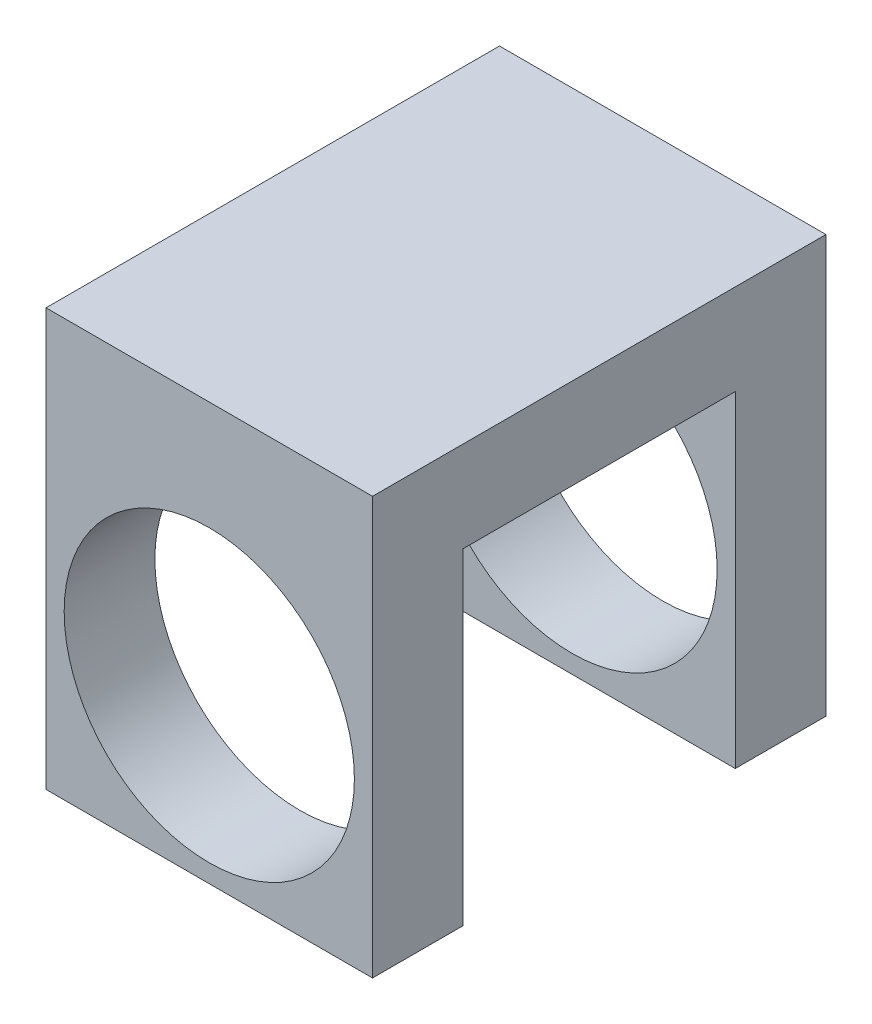
ISO-10303-21;
HEADER;
FILE_DESCRIPTION(('STEP AP214'),'2;1');
FILE_NAME('part.step','',(''),(''),'','','');
FILE_SCHEMA(('AUTOMOTIVE_DESIGN { 1 0 10303 214 1 1 1 1 }'));
ENDSEC;
DATA;
#1=APPLICATION_CONTEXT('core data for automotive mechanical design processes');
#2=APPLICATION_PROTOCOL_DEFINITION('international standard','automotive_design',2000,#1);
#3=PRODUCT_CONTEXT('',#1,'mechanical');
#4=PRODUCT('Part','Part','',(#3));
#5=PRODUCT_RELATED_PRODUCT_CATEGORY('part','',(#4));
#6=PRODUCT_DEFINITION_FORMATION('','',#4);
#7=PRODUCT_DEFINITION_CONTEXT('part definition',#1,'design');
#8=PRODUCT_DEFINITION('design','',#6,#7);
#9=PRODUCT_DEFINITION_SHAPE('','',#8);
#10=(LENGTH_UNIT() NAMED_UNIT(*) SI_UNIT(.MILLI.,.METRE.));
#11=(NAMED_UNIT(*) PLANE_ANGLE_UNIT() SI_UNIT($,.RADIAN.));
#12=(NAMED_UNIT(*) SI_UNIT($,.STERADIAN.) SOLID_ANGLE_UNIT());
#13=UNCERTAINTY_MEASURE_WITH_UNIT(LENGTH_MEASURE(1.E-05),#10,'distance_accuracy_value','');
#14=(GEOMETRIC_REPRESENTATION_CONTEXT(3) GLOBAL_UNCERTAINTY_ASSIGNED_CONTEXT((#13)) GLOBAL_UNIT_ASSIGNED_CONTEXT((#10,
#11,#12)) REPRESENTATION_CONTEXT('',''));
#15=CARTESIAN_POINT('',(0.,0.,0.));
#16=DIRECTION('',(0.,0.,1.));
#17=DIRECTION('',(1.,0.,0.));
#18=AXIS2_PLACEMENT_3D('',#15,#16,#17);
#19=CARTESIAN_POINT('',(0.,9.,0.));
#20=DIRECTION('',(0.,-1.,0.));
#21=DIRECTION('',(0.,0.,-1.));
#22=AXIS2_PLACEMENT_3D('',#19,#20,#21);
#23=PLANE('',#22);
#24=DIRECTION('',(0.,0.,1.));
#25=VECTOR('',#24,1.);
#26=CARTESIAN_POINT('',(-9.,9.,5.));
#27=LINE('',#26,#25);
#28=CARTESIAN_POINT('',(-9.,9.,-15.));
#29=VERTEX_POINT('',#28);
#30=CARTESIAN_POINT('',(-9.,9.,0.));
#31=VERTEX_POINT('',#30);
#32=EDGE_CURVE('E117',#29,#31,#27,.T.);
#33=ORIENTED_EDGE('',*,*,#32,.F.);
#34=DIRECTION('',(-1.,0.,0.));
#35=VECTOR('',#34,1.);
#36=CARTESIAN_POINT('',(-9.,9.,-15.));
#37=LINE('',#36,#35);
#38=CARTESIAN_POINT('',(9.,9.,-15.));
#39=VERTEX_POINT('',#38);
#40=EDGE_CURVE('E122',#39,#29,#37,.T.);
#41=ORIENTED_EDGE('',*,*,#40,.F.);
#42=DIRECTION('',(0.,0.,-1.));
#43=VECTOR('',#42,1.);
#44=CARTESIAN_POINT('',(9.,9.,5.));
#45=LINE('',#44,#43);
#46=CARTESIAN_POINT('',(9.,9.,0.));
#47=VERTEX_POINT('',#46);
#48=EDGE_CURVE('E121',#47,#39,#45,.T.);
#49=ORIENTED_EDGE('',*,*,#48,.F.);
#50=DIRECTION('',(-1.,0.,0.));
#51=VECTOR('',#50,1.);
#52=CARTESIAN_POINT('',(-9.,9.,0.));
#53=LINE('',#52,#51);
#54=EDGE_CURVE('E101',#47,#31,#53,.T.);
#55=ORIENTED_EDGE('',*,*,#54,.T.);
#56=EDGE_LOOP('',(#33,#41,#49,#55));
#57=FACE_BOUND('',#56,.T.);
#58=ADVANCED_FACE('F43',(#57),#23,.T.);
#59=CARTESIAN_POINT('',(9.,-9.,5.));
#60=DIRECTION('',(-1.,0.,0.));
#61=DIRECTION('',(0.,0.,1.));
#62=AXIS2_PLACEMENT_3D('',#59,#60,#61);
#63=PLANE('',#62);
#64=DIRECTION('',(0.,1.,0.));
#65=VECTOR('',#64,1.);
#66=CARTESIAN_POINT('',(9.,-9.,0.));
#67=LINE('',#66,#65);
#68=CARTESIAN_POINT('',(9.,-9.,0.));
#69=VERTEX_POINT('',#68);
#70=EDGE_CURVE('E96',#69,#47,#67,.T.);
#71=ORIENTED_EDGE('',*,*,#70,.T.);
#72=ORIENTED_EDGE('',*,*,#48,.T.);
#73=DIRECTION('',(0.,1.,0.));
#74=VECTOR('',#73,1.);
#75=CARTESIAN_POINT('',(9.,-9.,-15.));
#76=LINE('',#75,#74);
#77=CARTESIAN_POINT('',(9.,-9.,-15.));
#78=VERTEX_POINT('',#77);
#79=EDGE_CURVE('E58',#78,#39,#76,.T.);
#80=ORIENTED_EDGE('',*,*,#79,.F.);
#81=DIRECTION('',(0.,0.,1.));
#82=VECTOR('',#81,1.);
#83=CARTESIAN_POINT('',(9.,-9.,-20.));
#84=LINE('',#83,#82);
#85=CARTESIAN_POINT('',(9.,-9.,-20.));
#86=VERTEX_POINT('',#85);
#87=EDGE_CURVE('E181',#86,#78,#84,.T.);
#88=ORIENTED_EDGE('',*,*,#87,.F.);
#89=DIRECTION('',(0.,-1.,0.));
#90=VECTOR('',#89,1.);
#91=CARTESIAN_POINT('',(9.,14.,-20.));
#92=LINE('',#91,#90);
#93=CARTESIAN_POINT('',(9.,14.,-20.));
#94=VERTEX_POINT('',#93);
#95=EDGE_CURVE('E134',#94,#86,#92,.T.);
#96=ORIENTED_EDGE('',*,*,#95,.F.);
#97=DIRECTION('',(0.,0.,-1.));
#98=VECTOR('',#97,1.);
#99=CARTESIAN_POINT('',(9.,14.,5.));
#100=LINE('',#99,#98);
#101=CARTESIAN_POINT('',(9.,14.,5.));
#102=VERTEX_POINT('',#101);
#103=EDGE_CURVE('E163',#102,#94,#100,.T.);
#104=ORIENTED_EDGE('',*,*,#103,.F.);
#105=DIRECTION('',(0.,1.,0.));
#106=VECTOR('',#105,1.);
#107=CARTESIAN_POINT('',(9.,-9.,5.));
#108=LINE('',#107,#106);
#109=CARTESIAN_POINT('',(9.,-9.,5.));
#110=VERTEX_POINT('',#109);
#111=EDGE_CURVE('E90',#110,#102,#108,.T.);
#112=ORIENTED_EDGE('',*,*,#111,.F.);
#113=DIRECTION('',(0.,0.,-1.));
#114=VECTOR('',#113,1.);
#115=CARTESIAN_POINT('',(9.,-9.,5.));
#116=LINE('',#115,#114);
#117=EDGE_CURVE('E51',#110,#69,#116,.T.);
#118=ORIENTED_EDGE('',*,*,#117,.T.);
#119=EDGE_LOOP('',(#71,#72,#80,#88,#96,#104,#112,#118));
#120=FACE_BOUND('',#119,.T.);
#121=ADVANCED_FACE('F45',(#120),#63,.F.);
#122=CARTESIAN_POINT('',(-9.,-9.,5.));
#123=DIRECTION('',(1.,0.,0.));
#124=DIRECTION('',(0.,0.,-1.));
#125=AXIS2_PLACEMENT_3D('',#122,#123,#124);
#126=PLANE('',#125);
#127=DIRECTION('',(0.,-1.,0.));
#128=VECTOR('',#127,1.);
#129=CARTESIAN_POINT('',(-9.,-9.,0.));
#130=LINE('',#129,#128);
#131=CARTESIAN_POINT('',(-9.,-9.,0.));
#132=VERTEX_POINT('',#131);
#133=EDGE_CURVE('E91',#31,#132,#130,.T.);
#134=ORIENTED_EDGE('',*,*,#133,.T.);
#135=DIRECTION('',(0.,0.,-1.));
#136=VECTOR('',#135,1.);
#137=CARTESIAN_POINT('',(-9.,-9.,5.));
#138=LINE('',#137,#136);
#139=CARTESIAN_POINT('',(-9.,-9.,5.));
#140=VERTEX_POINT('',#139);
#141=EDGE_CURVE('E11',#140,#132,#138,.T.);
#142=ORIENTED_EDGE('',*,*,#141,.F.);
#143=DIRECTION('',(0.,-1.,0.));
#144=VECTOR('',#143,1.);
#145=CARTESIAN_POINT('',(-9.,-9.,5.));
#146=LINE('',#145,#144);
#147=CARTESIAN_POINT('',(-9.,14.,5.));
#148=VERTEX_POINT('',#147);
#149=EDGE_CURVE('E140',#148,#140,#146,.T.);
#150=ORIENTED_EDGE('',*,*,#149,.F.);
#151=DIRECTION('',(0.,0.,1.));
#152=VECTOR('',#151,1.);
#153=CARTESIAN_POINT('',(-9.,14.,5.));
#154=LINE('',#153,#152);
#155=CARTESIAN_POINT('',(-9.,14.,-20.));
#156=VERTEX_POINT('',#155);
#157=EDGE_CURVE('E123',#156,#148,#154,.T.);
#158=ORIENTED_EDGE('',*,*,#157,.F.);
#159=DIRECTION('',(0.,-1.,0.));
#160=VECTOR('',#159,1.);
#161=CARTESIAN_POINT('',(-9.,14.,-20.));
#162=LINE('',#161,#160);
#163=CARTESIAN_POINT('',(-9.,-9.,-20.));
#164=VERTEX_POINT('',#163);
#165=EDGE_CURVE('E131',#156,#164,#162,.T.);
#166=ORIENTED_EDGE('',*,*,#165,.T.);
#167=DIRECTION('',(0.,0.,-1.));
#168=VECTOR('',#167,1.);
#169=CARTESIAN_POINT('',(-9.,-9.,-20.));
#170=LINE('',#169,#168);
#171=CARTESIAN_POINT('',(-9.,-9.,-15.));
#172=VERTEX_POINT('',#171);
#173=EDGE_CURVE('E173',#172,#164,#170,.T.);
#174=ORIENTED_EDGE('',*,*,#173,.F.);
#175=DIRECTION('',(0.,1.,0.));
#176=VECTOR('',#175,1.);
#177=CARTESIAN_POINT('',(-9.,-9.,-15.));
#178=LINE('',#177,#176);
#179=EDGE_CURVE('E186',#172,#29,#178,.T.);
#180=ORIENTED_EDGE('',*,*,#179,.T.);
#181=ORIENTED_EDGE('',*,*,#32,.T.);
#182=EDGE_LOOP('',(#134,#142,#150,#158,#166,#174,#180,#181));
#183=FACE_BOUND('',#182,.T.);
#184=ADVANCED_FACE('F113',(#183),#126,.F.);
#185=CARTESIAN_POINT('',(-9.,-9.,5.));
#186=DIRECTION('',(0.,1.,0.));
#187=DIRECTION('',(0.,0.,1.));
#188=AXIS2_PLACEMENT_3D('',#185,#186,#187);
#189=PLANE('',#188);
#190=DIRECTION('',(1.,0.,0.));
#191=VECTOR('',#190,1.);
#192=CARTESIAN_POINT('',(-9.,-9.,0.));
#193=LINE('',#192,#191);
#194=EDGE_CURVE('E82',#132,#69,#193,.T.);
#195=ORIENTED_EDGE('',*,*,#194,.T.);
#196=ORIENTED_EDGE('',*,*,#117,.F.);
#197=DIRECTION('',(1.,0.,0.));
#198=VECTOR('',#197,1.);
#199=CARTESIAN_POINT('',(-9.,-9.,5.));
#200=LINE('',#199,#198);
#201=EDGE_CURVE('E67',#140,#110,#200,.T.);
#202=ORIENTED_EDGE('',*,*,#201,.F.);
#203=ORIENTED_EDGE('',*,*,#141,.T.);
#204=EDGE_LOOP('',(#195,#196,#202,#203));
#205=FACE_BOUND('',#204,.T.);
#206=ADVANCED_FACE('F84',(#205),#189,.F.);
#207=CARTESIAN_POINT('',(0.,0.,5.));
#208=DIRECTION('',(0.,0.,-1.));
#209=DIRECTION('',(-1.,0.,0.));
#210=AXIS2_PLACEMENT_3D('',#207,#208,#209);
#211=PLANE('',#210);
#212=CARTESIAN_POINT('',(0.,0.,5.));
#213=DIRECTION('',(0.,0.,1.));
#214=DIRECTION('',(1.,0.,0.));
#215=AXIS2_PLACEMENT_3D('',#212,#213,#214);
#216=CIRCLE('',#215,8.);
#217=CARTESIAN_POINT('',(8.,0.,5.));
#218=VERTEX_POINT('',#217);
#219=EDGE_CURVE('E106',#218,#218,#216,.T.);
#220=ORIENTED_EDGE('',*,*,#219,.F.);
#221=EDGE_LOOP('',(#220));
#222=FACE_BOUND('',#221,.T.);
#223=ORIENTED_EDGE('',*,*,#111,.T.);
#224=DIRECTION('',(1.,0.,0.));
#225=VECTOR('',#224,1.);
#226=CARTESIAN_POINT('',(-9.,14.,5.));
#227=LINE('',#226,#225);
#228=EDGE_CURVE('E126',#148,#102,#227,.T.);
#229=ORIENTED_EDGE('',*,*,#228,.F.);
#230=ORIENTED_EDGE('',*,*,#149,.T.);
#231=ORIENTED_EDGE('',*,*,#201,.T.);
#232=EDGE_LOOP('',(#223,#229,#230,#231));
#233=FACE_BOUND('',#232,.T.);
#234=ADVANCED_FACE('F142',(#222,#233),#211,.F.);
#235=CARTESIAN_POINT('',(0.,0.,0.));
#236=DIRECTION('',(0.,0.,-1.));
#237=DIRECTION('',(-1.,0.,0.));
#238=AXIS2_PLACEMENT_3D('',#235,#236,#237);
#239=PLANE('',#238);
#240=CARTESIAN_POINT('',(0.,0.,0.));
#241=DIRECTION('',(0.,0.,1.));
#242=DIRECTION('',(1.,0.,0.));
#243=AXIS2_PLACEMENT_3D('',#240,#241,#242);
#244=CIRCLE('',#243,8.);
#245=CARTESIAN_POINT('',(8.,0.,0.));
#246=VERTEX_POINT('',#245);
#247=EDGE_CURVE('E102',#246,#246,#244,.T.);
#248=ORIENTED_EDGE('',*,*,#247,.T.);
#249=EDGE_LOOP('',(#248));
#250=FACE_BOUND('',#249,.T.);
#251=ORIENTED_EDGE('',*,*,#70,.F.);
#252=ORIENTED_EDGE('',*,*,#194,.F.);
#253=ORIENTED_EDGE('',*,*,#133,.F.);
#254=ORIENTED_EDGE('',*,*,#54,.F.);
#255=EDGE_LOOP('',(#251,#252,#253,#254));
#256=FACE_BOUND('',#255,.T.);
#257=ADVANCED_FACE('F99',(#250,#256),#239,.T.);
#258=CARTESIAN_POINT('',(0.,0.,0.));
#259=DIRECTION('',(0.,0.,1.));
#260=DIRECTION('',(1.,0.,0.));
#261=AXIS2_PLACEMENT_3D('',#258,#259,#260);
#262=CYLINDRICAL_SURFACE('',#261,8.);
#263=ORIENTED_EDGE('',*,*,#247,.F.);
#264=EDGE_LOOP('',(#263));
#265=FACE_BOUND('',#264,.T.);
#266=ORIENTED_EDGE('',*,*,#219,.T.);
#267=EDGE_LOOP('',(#266));
#268=FACE_BOUND('',#267,.T.);
#269=ADVANCED_FACE('F226',(#265,#268),#262,.F.);
#270=CARTESIAN_POINT('',(-9.,14.,-20.));
#271=DIRECTION('',(0.,0.,1.));
#272=DIRECTION('',(1.,0.,0.));
#273=AXIS2_PLACEMENT_3D('',#270,#271,#272);
#274=PLANE('',#273);
#275=CARTESIAN_POINT('',(0.,0.,-20.));
#276=DIRECTION('',(0.,0.,1.));
#277=DIRECTION('',(1.,0.,0.));
#278=AXIS2_PLACEMENT_3D('',#275,#276,#277);
#279=CIRCLE('',#278,8.);
#280=CARTESIAN_POINT('',(8.,0.,-20.));
#281=VERTEX_POINT('',#280);
#282=EDGE_CURVE('E193',#281,#281,#279,.T.);
#283=ORIENTED_EDGE('',*,*,#282,.T.);
#284=EDGE_LOOP('',(#283));
#285=FACE_BOUND('',#284,.T.);
#286=ORIENTED_EDGE('',*,*,#95,.T.);
#287=DIRECTION('',(1.,0.,0.));
#288=VECTOR('',#287,1.);
#289=CARTESIAN_POINT('',(-9.,-9.,-20.));
#290=LINE('',#289,#288);
#291=EDGE_CURVE('E170',#164,#86,#290,.T.);
#292=ORIENTED_EDGE('',*,*,#291,.F.);
#293=ORIENTED_EDGE('',*,*,#165,.F.);
#294=DIRECTION('',(-1.,0.,0.));
#295=VECTOR('',#294,1.);
#296=CARTESIAN_POINT('',(-9.,14.,-20.));
#297=LINE('',#296,#295);
#298=EDGE_CURVE('E135',#94,#156,#297,.T.);
#299=ORIENTED_EDGE('',*,*,#298,.F.);
#300=EDGE_LOOP('',(#286,#292,#293,#299));
#301=FACE_BOUND('',#300,.T.);
#302=ADVANCED_FACE('F167',(#285,#301),#274,.F.);
#303=CARTESIAN_POINT('',(0.,14.,0.));
#304=DIRECTION('',(0.,-1.,0.));
#305=DIRECTION('',(0.,0.,-1.));
#306=AXIS2_PLACEMENT_3D('',#303,#304,#305);
#307=PLANE('',#306);
#308=ORIENTED_EDGE('',*,*,#157,.T.);
#309=ORIENTED_EDGE('',*,*,#228,.T.);
#310=ORIENTED_EDGE('',*,*,#103,.T.);
#311=ORIENTED_EDGE('',*,*,#298,.T.);
#312=EDGE_LOOP('',(#308,#309,#310,#311));
#313=FACE_BOUND('',#312,.T.);
#314=ADVANCED_FACE('F162',(#313),#307,.F.);
#315=CARTESIAN_POINT('',(-9.,-9.,-15.));
#316=DIRECTION('',(0.,0.,-1.));
#317=DIRECTION('',(-1.,0.,0.));
#318=AXIS2_PLACEMENT_3D('',#315,#316,#317);
#319=PLANE('',#318);
#320=CARTESIAN_POINT('',(0.,0.,-15.));
#321=DIRECTION('',(0.,0.,1.));
#322=DIRECTION('',(1.,0.,0.));
#323=AXIS2_PLACEMENT_3D('',#320,#321,#322);
#324=CIRCLE('',#323,8.);
#325=CARTESIAN_POINT('',(8.,0.,-15.));
#326=VERTEX_POINT('',#325);
#327=EDGE_CURVE('E198',#326,#326,#324,.T.);
#328=ORIENTED_EDGE('',*,*,#327,.F.);
#329=EDGE_LOOP('',(#328));
#330=FACE_BOUND('',#329,.T.);
#331=ORIENTED_EDGE('',*,*,#40,.T.);
#332=ORIENTED_EDGE('',*,*,#179,.F.);
#333=DIRECTION('',(-1.,0.,0.));
#334=VECTOR('',#333,1.);
#335=CARTESIAN_POINT('',(-9.,-9.,-15.));
#336=LINE('',#335,#334);
#337=EDGE_CURVE('E183',#78,#172,#336,.T.);
#338=ORIENTED_EDGE('',*,*,#337,.F.);
#339=ORIENTED_EDGE('',*,*,#79,.T.);
#340=EDGE_LOOP('',(#331,#332,#338,#339));
#341=FACE_BOUND('',#340,.T.);
#342=ADVANCED_FACE('F188',(#330,#341),#319,.F.);
#343=CARTESIAN_POINT('',(0.,-9.,0.));
#344=DIRECTION('',(0.,1.,0.));
#345=DIRECTION('',(0.,0.,1.));
#346=AXIS2_PLACEMENT_3D('',#343,#344,#345);
#347=PLANE('',#346);
#348=ORIENTED_EDGE('',*,*,#173,.T.);
#349=ORIENTED_EDGE('',*,*,#291,.T.);
#350=ORIENTED_EDGE('',*,*,#87,.T.);
#351=ORIENTED_EDGE('',*,*,#337,.T.);
#352=EDGE_LOOP('',(#348,#349,#350,#351));
#353=FACE_BOUND('',#352,.T.);
#354=ADVANCED_FACE('F182',(#353),#347,.F.);
#355=CARTESIAN_POINT('',(0.,0.,-33.));
#356=DIRECTION('',(0.,0.,1.));
#357=DIRECTION('',(1.,0.,0.));
#358=AXIS2_PLACEMENT_3D('',#355,#356,#357);
#359=CYLINDRICAL_SURFACE('',#358,8.);
#360=ORIENTED_EDGE('',*,*,#327,.T.);
#361=EDGE_LOOP('',(#360));
#362=FACE_BOUND('',#361,.T.);
#363=ORIENTED_EDGE('',*,*,#282,.F.);
#364=EDGE_LOOP('',(#363));
#365=FACE_BOUND('',#364,.T.);
#366=ADVANCED_FACE('F206',(#362,#365),#359,.F.);
#367=CLOSED_SHELL('',(#58,#121,#184,#206,#234,#257,#269,#302,#314,#342,#354,#366));
#368=MANIFOLD_SOLID_BREP('B2',#367);
#369=ADVANCED_BREP_SHAPE_REPRESENTATION('',(#18,#368),#14);
#370=SHAPE_DEFINITION_REPRESENTATION(#9,#369);
ENDSEC;
END-ISO-10303-21;
